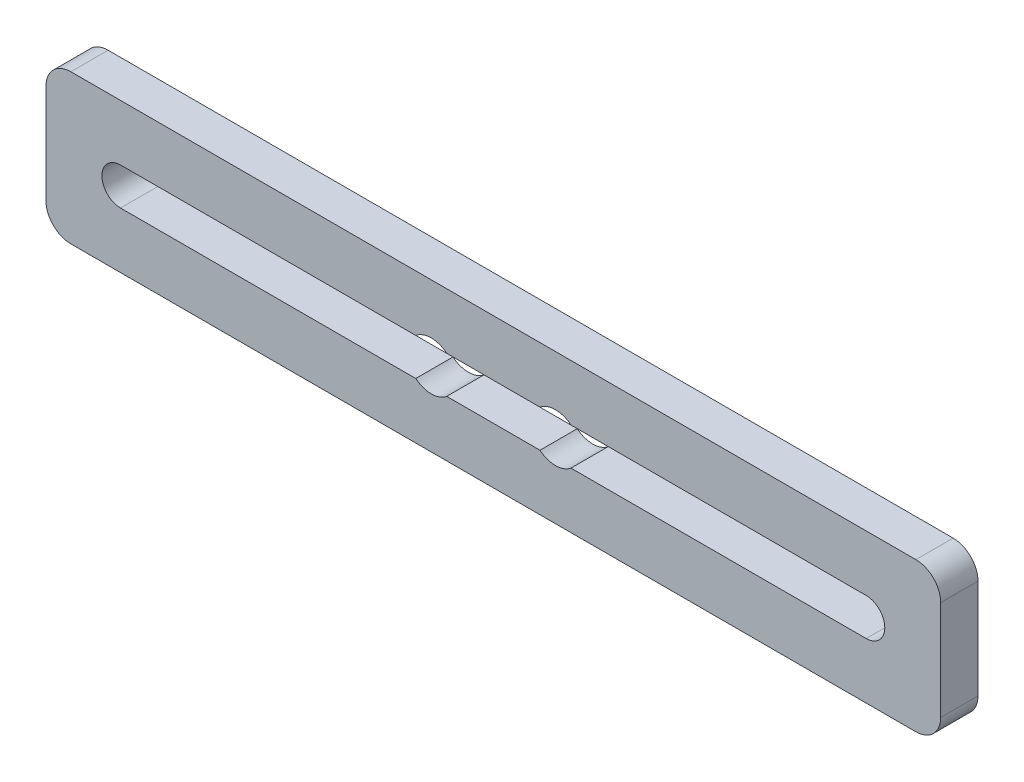
ISO-10303-21;
HEADER;
FILE_DESCRIPTION(('STEP AP214'),'2;1');
FILE_NAME('part.step','',(''),(''),'','','');
FILE_SCHEMA(('AUTOMOTIVE_DESIGN { 1 0 10303 214 1 1 1 1 }'));
ENDSEC;
DATA;
#1=APPLICATION_CONTEXT('core data for automotive mechanical design processes');
#2=APPLICATION_PROTOCOL_DEFINITION('international standard','automotive_design',2000,#1);
#3=PRODUCT_CONTEXT('',#1,'mechanical');
#4=PRODUCT('Part','Part','',(#3));
#5=PRODUCT_RELATED_PRODUCT_CATEGORY('part','',(#4));
#6=PRODUCT_DEFINITION_FORMATION('','',#4);
#7=PRODUCT_DEFINITION_CONTEXT('part definition',#1,'design');
#8=PRODUCT_DEFINITION('design','',#6,#7);
#9=PRODUCT_DEFINITION_SHAPE('','',#8);
#10=(LENGTH_UNIT() NAMED_UNIT(*) SI_UNIT(.MILLI.,.METRE.));
#11=(NAMED_UNIT(*) PLANE_ANGLE_UNIT() SI_UNIT($,.RADIAN.));
#12=(NAMED_UNIT(*) SI_UNIT($,.STERADIAN.) SOLID_ANGLE_UNIT());
#13=UNCERTAINTY_MEASURE_WITH_UNIT(LENGTH_MEASURE(1.E-05),#10,'distance_accuracy_value','');
#14=(GEOMETRIC_REPRESENTATION_CONTEXT(3) GLOBAL_UNCERTAINTY_ASSIGNED_CONTEXT((#13)) GLOBAL_UNIT_ASSIGNED_CONTEXT((#10,
#11,#12)) REPRESENTATION_CONTEXT('',''));
#15=CARTESIAN_POINT('',(0.,0.,0.));
#16=DIRECTION('',(0.,0.,1.));
#17=DIRECTION('',(1.,0.,0.));
#18=AXIS2_PLACEMENT_3D('',#15,#16,#17);
#19=CARTESIAN_POINT('',(6.,-4.5,0.));
#20=DIRECTION('',(0.,1.,0.));
#21=DIRECTION('',(0.,0.,1.));
#22=AXIS2_PLACEMENT_3D('',#19,#20,#21);
#23=PLANE('',#22);
#24=DIRECTION('',(-1.,0.,0.));
#25=VECTOR('',#24,1.);
#26=CARTESIAN_POINT('',(6.,-4.5,0.));
#27=LINE('',#26,#25);
#28=CARTESIAN_POINT('',(39.7540064205623,-4.5,0.));
#29=VERTEX_POINT('',#28);
#30=CARTESIAN_POINT('',(32.2459935794377,-4.5,0.));
#31=VERTEX_POINT('',#30);
#32=EDGE_CURVE('E233',#29,#31,#27,.T.);
#33=ORIENTED_EDGE('',*,*,#32,.F.);
#34=DIRECTION('',(0.,0.,1.));
#35=VECTOR('',#34,1.);
#36=CARTESIAN_POINT('',(39.7540064205623,-4.5,0.));
#37=LINE('',#36,#35);
#38=CARTESIAN_POINT('',(39.7540064205623,-4.5,3.));
#39=VERTEX_POINT('',#38);
#40=EDGE_CURVE('E223',#29,#39,#37,.T.);
#41=ORIENTED_EDGE('',*,*,#40,.T.);
#42=DIRECTION('',(-1.,0.,0.));
#43=VECTOR('',#42,1.);
#44=CARTESIAN_POINT('',(6.,-4.5,3.));
#45=LINE('',#44,#43);
#46=CARTESIAN_POINT('',(32.2459935794377,-4.5,3.));
#47=VERTEX_POINT('',#46);
#48=EDGE_CURVE('E398',#39,#47,#45,.T.);
#49=ORIENTED_EDGE('',*,*,#48,.T.);
#50=DIRECTION('',(0.,0.,1.));
#51=VECTOR('',#50,1.);
#52=CARTESIAN_POINT('',(32.2459935794377,-4.5,0.));
#53=LINE('',#52,#51);
#54=EDGE_CURVE('E251',#47,#31,#53,.F.);
#55=ORIENTED_EDGE('',*,*,#54,.T.);
#56=EDGE_LOOP('',(#33,#41,#49,#55));
#57=FACE_BOUND('',#56,.T.);
#58=ADVANCED_FACE('F43',(#57),#23,.F.);
#59=CARTESIAN_POINT('',(29.7540064205623,-4.5,0.));
#60=VERTEX_POINT('',#59);
#61=CARTESIAN_POINT('',(6.,-4.5,0.));
#62=VERTEX_POINT('',#61);
#63=EDGE_CURVE('E234',#60,#62,#27,.T.);
#64=ORIENTED_EDGE('',*,*,#63,.F.);
#65=DIRECTION('',(0.,0.,1.));
#66=VECTOR('',#65,1.);
#67=CARTESIAN_POINT('',(29.7540064205623,-4.5,0.));
#68=LINE('',#67,#66);
#69=CARTESIAN_POINT('',(29.7540064205623,-4.5,3.));
#70=VERTEX_POINT('',#69);
#71=EDGE_CURVE('E248',#60,#70,#68,.T.);
#72=ORIENTED_EDGE('',*,*,#71,.T.);
#73=CARTESIAN_POINT('',(6.,-4.5,3.));
#74=VERTEX_POINT('',#73);
#75=EDGE_CURVE('E214',#70,#74,#45,.T.);
#76=ORIENTED_EDGE('',*,*,#75,.T.);
#77=DIRECTION('',(0.,0.,1.));
#78=VECTOR('',#77,1.);
#79=CARTESIAN_POINT('',(6.,-4.5,0.));
#80=LINE('',#79,#78);
#81=EDGE_CURVE('E280',#62,#74,#80,.T.);
#82=ORIENTED_EDGE('',*,*,#81,.F.);
#83=EDGE_LOOP('',(#64,#72,#76,#82));
#84=FACE_BOUND('',#83,.T.);
#85=ADVANCED_FACE('F374',(#84),#23,.F.);
#86=CARTESIAN_POINT('',(6.,-7.5,0.));
#87=DIRECTION('',(0.,-1.,0.));
#88=DIRECTION('',(0.,0.,-1.));
#89=AXIS2_PLACEMENT_3D('',#86,#87,#88);
#90=PLANE('',#89);
#91=DIRECTION('',(1.,0.,0.));
#92=VECTOR('',#91,1.);
#93=CARTESIAN_POINT('',(6.,-7.5,0.));
#94=LINE('',#93,#92);
#95=CARTESIAN_POINT('',(42.2459935794377,-7.5,0.));
#96=VERTEX_POINT('',#95);
#97=CARTESIAN_POINT('',(66.,-7.5,0.));
#98=VERTEX_POINT('',#97);
#99=EDGE_CURVE('E241',#96,#98,#94,.T.);
#100=ORIENTED_EDGE('',*,*,#99,.F.);
#101=DIRECTION('',(0.,0.,1.));
#102=VECTOR('',#101,1.);
#103=CARTESIAN_POINT('',(42.2459935794377,-7.5,0.));
#104=LINE('',#103,#102);
#105=CARTESIAN_POINT('',(42.2459935794377,-7.5,3.));
#106=VERTEX_POINT('',#105);
#107=EDGE_CURVE('E274',#96,#106,#104,.T.);
#108=ORIENTED_EDGE('',*,*,#107,.T.);
#109=DIRECTION('',(1.,0.,0.));
#110=VECTOR('',#109,1.);
#111=CARTESIAN_POINT('',(6.,-7.5,3.));
#112=LINE('',#111,#110);
#113=CARTESIAN_POINT('',(66.,-7.5,3.));
#114=VERTEX_POINT('',#113);
#115=EDGE_CURVE('E212',#106,#114,#112,.T.);
#116=ORIENTED_EDGE('',*,*,#115,.T.);
#117=DIRECTION('',(0.,0.,1.));
#118=VECTOR('',#117,1.);
#119=CARTESIAN_POINT('',(66.,-7.5,0.));
#120=LINE('',#119,#118);
#121=EDGE_CURVE('E275',#98,#114,#120,.T.);
#122=ORIENTED_EDGE('',*,*,#121,.F.);
#123=EDGE_LOOP('',(#100,#108,#116,#122));
#124=FACE_BOUND('',#123,.T.);
#125=ADVANCED_FACE('F273',(#124),#90,.F.);
#126=CARTESIAN_POINT('',(32.2459935794377,-7.5,3.));
#127=VERTEX_POINT('',#126);
#128=CARTESIAN_POINT('',(39.7540064205623,-7.5,3.));
#129=VERTEX_POINT('',#128);
#130=EDGE_CURVE('E203',#127,#129,#112,.T.);
#131=ORIENTED_EDGE('',*,*,#130,.T.);
#132=DIRECTION('',(0.,0.,1.));
#133=VECTOR('',#132,1.);
#134=CARTESIAN_POINT('',(39.7540064205623,-7.5,0.));
#135=LINE('',#134,#133);
#136=CARTESIAN_POINT('',(39.7540064205623,-7.5,0.));
#137=VERTEX_POINT('',#136);
#138=EDGE_CURVE('E306',#129,#137,#135,.F.);
#139=ORIENTED_EDGE('',*,*,#138,.T.);
#140=CARTESIAN_POINT('',(32.2459935794377,-7.5,0.));
#141=VERTEX_POINT('',#140);
#142=EDGE_CURVE('E240',#141,#137,#94,.T.);
#143=ORIENTED_EDGE('',*,*,#142,.F.);
#144=DIRECTION('',(0.,0.,1.));
#145=VECTOR('',#144,1.);
#146=CARTESIAN_POINT('',(32.2459935794377,-7.5,0.));
#147=LINE('',#146,#145);
#148=EDGE_CURVE('E191',#141,#127,#147,.T.);
#149=ORIENTED_EDGE('',*,*,#148,.T.);
#150=EDGE_LOOP('',(#131,#139,#143,#149));
#151=FACE_BOUND('',#150,.T.);
#152=ADVANCED_FACE('F428',(#151),#90,.F.);
#153=CARTESIAN_POINT('',(0.,0.,3.));
#154=DIRECTION('',(1.,0.,0.));
#155=DIRECTION('',(0.,1.,0.));
#156=AXIS2_PLACEMENT_3D('',#153,#154,#155);
#157=PLANE('',#156);
#158=DIRECTION('',(0.,-1.,0.));
#159=VECTOR('',#158,1.);
#160=CARTESIAN_POINT('',(0.,0.,0.));
#161=LINE('',#160,#159);
#162=CARTESIAN_POINT('',(0.,-2.,0.));
#163=VERTEX_POINT('',#162);
#164=CARTESIAN_POINT('',(0.,-10.,0.));
#165=VERTEX_POINT('',#164);
#166=EDGE_CURVE('E295',#163,#165,#161,.T.);
#167=ORIENTED_EDGE('',*,*,#166,.T.);
#168=DIRECTION('',(0.,0.,-1.));
#169=VECTOR('',#168,1.);
#170=CARTESIAN_POINT('',(0.,-10.,3.));
#171=LINE('',#170,#169);
#172=CARTESIAN_POINT('',(0.,-10.,3.));
#173=VERTEX_POINT('',#172);
#174=EDGE_CURVE('E11',#165,#173,#171,.F.);
#175=ORIENTED_EDGE('',*,*,#174,.T.);
#176=DIRECTION('',(0.,-1.,0.));
#177=VECTOR('',#176,1.);
#178=CARTESIAN_POINT('',(0.,0.,3.));
#179=LINE('',#178,#177);
#180=CARTESIAN_POINT('',(0.,-2.,3.));
#181=VERTEX_POINT('',#180);
#182=EDGE_CURVE('E285',#181,#173,#179,.T.);
#183=ORIENTED_EDGE('',*,*,#182,.F.);
#184=DIRECTION('',(0.,0.,-1.));
#185=VECTOR('',#184,1.);
#186=CARTESIAN_POINT('',(0.,-2.,3.));
#187=LINE('',#186,#185);
#188=EDGE_CURVE('E51',#181,#163,#187,.T.);
#189=ORIENTED_EDGE('',*,*,#188,.T.);
#190=EDGE_LOOP('',(#167,#175,#183,#189));
#191=FACE_BOUND('',#190,.T.);
#192=ADVANCED_FACE('F342',(#191),#157,.F.);
#193=CARTESIAN_POINT('',(0.,-12.,3.));
#194=DIRECTION('',(0.,1.,0.));
#195=DIRECTION('',(0.,0.,1.));
#196=AXIS2_PLACEMENT_3D('',#193,#194,#195);
#197=PLANE('',#196);
#198=DIRECTION('',(1.,0.,0.));
#199=VECTOR('',#198,1.);
#200=CARTESIAN_POINT('',(0.,-12.,0.));
#201=LINE('',#200,#199);
#202=CARTESIAN_POINT('',(2.00000000000001,-12.,0.));
#203=VERTEX_POINT('',#202);
#204=CARTESIAN_POINT('',(70.,-12.,0.));
#205=VERTEX_POINT('',#204);
#206=EDGE_CURVE('E298',#203,#205,#201,.T.);
#207=ORIENTED_EDGE('',*,*,#206,.T.);
#208=DIRECTION('',(0.,0.,-1.));
#209=VECTOR('',#208,1.);
#210=CARTESIAN_POINT('',(70.,-12.,3.));
#211=LINE('',#210,#209);
#212=CARTESIAN_POINT('',(70.,-12.,3.));
#213=VERTEX_POINT('',#212);
#214=EDGE_CURVE('E58',#205,#213,#211,.F.);
#215=ORIENTED_EDGE('',*,*,#214,.T.);
#216=DIRECTION('',(1.,0.,0.));
#217=VECTOR('',#216,1.);
#218=CARTESIAN_POINT('',(0.,-12.,3.));
#219=LINE('',#218,#217);
#220=CARTESIAN_POINT('',(2.00000000000001,-12.,3.));
#221=VERTEX_POINT('',#220);
#222=EDGE_CURVE('E287',#221,#213,#219,.T.);
#223=ORIENTED_EDGE('',*,*,#222,.F.);
#224=DIRECTION('',(0.,0.,-1.));
#225=VECTOR('',#224,1.);
#226=CARTESIAN_POINT('',(2.00000000000001,-12.,3.));
#227=LINE('',#226,#225);
#228=EDGE_CURVE('E334',#221,#203,#227,.T.);
#229=ORIENTED_EDGE('',*,*,#228,.T.);
#230=EDGE_LOOP('',(#207,#215,#223,#229));
#231=FACE_BOUND('',#230,.T.);
#232=ADVANCED_FACE('F351',(#231),#197,.F.);
#233=CARTESIAN_POINT('',(72.,0.,3.));
#234=DIRECTION('',(-1.,0.,0.));
#235=DIRECTION('',(0.,0.,1.));
#236=AXIS2_PLACEMENT_3D('',#233,#234,#235);
#237=PLANE('',#236);
#238=DIRECTION('',(0.,1.,0.));
#239=VECTOR('',#238,1.);
#240=CARTESIAN_POINT('',(72.,0.,0.));
#241=LINE('',#240,#239);
#242=CARTESIAN_POINT('',(72.,-10.,0.));
#243=VERTEX_POINT('',#242);
#244=CARTESIAN_POINT('',(72.,-2.,0.));
#245=VERTEX_POINT('',#244);
#246=EDGE_CURVE('E300',#243,#245,#241,.T.);
#247=ORIENTED_EDGE('',*,*,#246,.T.);
#248=DIRECTION('',(0.,0.,-1.));
#249=VECTOR('',#248,1.);
#250=CARTESIAN_POINT('',(72.,-2.,3.));
#251=LINE('',#250,#249);
#252=CARTESIAN_POINT('',(72.,-2.,3.));
#253=VERTEX_POINT('',#252);
#254=EDGE_CURVE('E325',#245,#253,#251,.F.);
#255=ORIENTED_EDGE('',*,*,#254,.T.);
#256=DIRECTION('',(0.,1.,0.));
#257=VECTOR('',#256,1.);
#258=CARTESIAN_POINT('',(72.,0.,3.));
#259=LINE('',#258,#257);
#260=CARTESIAN_POINT('',(72.,-10.,3.));
#261=VERTEX_POINT('',#260);
#262=EDGE_CURVE('E290',#261,#253,#259,.T.);
#263=ORIENTED_EDGE('',*,*,#262,.F.);
#264=DIRECTION('',(0.,0.,-1.));
#265=VECTOR('',#264,1.);
#266=CARTESIAN_POINT('',(72.,-10.,3.));
#267=LINE('',#266,#265);
#268=EDGE_CURVE('E322',#261,#243,#267,.T.);
#269=ORIENTED_EDGE('',*,*,#268,.T.);
#270=EDGE_LOOP('',(#247,#255,#263,#269));
#271=FACE_BOUND('',#270,.T.);
#272=ADVANCED_FACE('F359',(#271),#237,.F.);
#273=CARTESIAN_POINT('',(0.,0.,3.));
#274=DIRECTION('',(0.,-1.,0.));
#275=DIRECTION('',(0.,0.,-1.));
#276=AXIS2_PLACEMENT_3D('',#273,#274,#275);
#277=PLANE('',#276);
#278=DIRECTION('',(-1.,0.,0.));
#279=VECTOR('',#278,1.);
#280=CARTESIAN_POINT('',(0.,0.,3.));
#281=LINE('',#280,#279);
#282=CARTESIAN_POINT('',(70.,0.,3.));
#283=VERTEX_POINT('',#282);
#284=CARTESIAN_POINT('',(2.,0.,3.));
#285=VERTEX_POINT('',#284);
#286=EDGE_CURVE('E192',#283,#285,#281,.T.);
#287=ORIENTED_EDGE('',*,*,#286,.F.);
#288=DIRECTION('',(0.,0.,-1.));
#289=VECTOR('',#288,1.);
#290=CARTESIAN_POINT('',(70.,0.,3.));
#291=LINE('',#290,#289);
#292=CARTESIAN_POINT('',(70.,0.,0.));
#293=VERTEX_POINT('',#292);
#294=EDGE_CURVE('E311',#283,#293,#291,.T.);
#295=ORIENTED_EDGE('',*,*,#294,.T.);
#296=DIRECTION('',(-1.,0.,0.));
#297=VECTOR('',#296,1.);
#298=CARTESIAN_POINT('',(0.,0.,0.));
#299=LINE('',#298,#297);
#300=CARTESIAN_POINT('',(2.,0.,0.));
#301=VERTEX_POINT('',#300);
#302=EDGE_CURVE('E288',#293,#301,#299,.T.);
#303=ORIENTED_EDGE('',*,*,#302,.T.);
#304=DIRECTION('',(0.,0.,-1.));
#305=VECTOR('',#304,1.);
#306=CARTESIAN_POINT('',(2.,0.,3.));
#307=LINE('',#306,#305);
#308=EDGE_CURVE('E309',#301,#285,#307,.F.);
#309=ORIENTED_EDGE('',*,*,#308,.T.);
#310=EDGE_LOOP('',(#287,#295,#303,#309));
#311=FACE_BOUND('',#310,.T.);
#312=ADVANCED_FACE('F367',(#311),#277,.F.);
#313=CARTESIAN_POINT('',(0.,0.,3.));
#314=DIRECTION('',(0.,0.,1.));
#315=DIRECTION('',(1.,0.,0.));
#316=AXIS2_PLACEMENT_3D('',#313,#314,#315);
#317=PLANE('',#316);
#318=CARTESIAN_POINT('',(41.,-6.,3.));
#319=DIRECTION('',(0.,0.,1.));
#320=DIRECTION('',(1.,0.,0.));
#321=AXIS2_PLACEMENT_3D('',#318,#319,#320);
#322=CIRCLE('',#321,1.95);
#323=CARTESIAN_POINT('',(42.2459935794377,-4.5,3.));
#324=VERTEX_POINT('',#323);
#325=EDGE_CURVE('E257',#324,#39,#322,.T.);
#326=ORIENTED_EDGE('',*,*,#325,.F.);
#327=CARTESIAN_POINT('',(66.,-4.5,3.));
#328=VERTEX_POINT('',#327);
#329=EDGE_CURVE('E244',#328,#324,#45,.T.);
#330=ORIENTED_EDGE('',*,*,#329,.F.);
#331=CARTESIAN_POINT('',(66.,-6.,3.));
#332=DIRECTION('',(0.,0.,1.));
#333=DIRECTION('',(1.,0.,0.));
#334=AXIS2_PLACEMENT_3D('',#331,#332,#333);
#335=CIRCLE('',#334,1.5);
#336=EDGE_CURVE('E210',#114,#328,#335,.T.);
#337=ORIENTED_EDGE('',*,*,#336,.F.);
#338=ORIENTED_EDGE('',*,*,#115,.F.);
#339=EDGE_CURVE('E204',#129,#106,#322,.T.);
#340=ORIENTED_EDGE('',*,*,#339,.F.);
#341=ORIENTED_EDGE('',*,*,#130,.F.);
#342=CARTESIAN_POINT('',(31.,-6.,3.));
#343=DIRECTION('',(0.,0.,1.));
#344=DIRECTION('',(-1.,0.,0.));
#345=AXIS2_PLACEMENT_3D('',#342,#343,#344);
#346=CIRCLE('',#345,1.95);
#347=CARTESIAN_POINT('',(29.7540064205623,-7.5,3.));
#348=VERTEX_POINT('',#347);
#349=EDGE_CURVE('E183',#348,#127,#346,.T.);
#350=ORIENTED_EDGE('',*,*,#349,.F.);
#351=CARTESIAN_POINT('',(6.,-7.5,3.));
#352=VERTEX_POINT('',#351);
#353=EDGE_CURVE('E200',#352,#348,#112,.T.);
#354=ORIENTED_EDGE('',*,*,#353,.F.);
#355=CARTESIAN_POINT('',(6.,-6.,3.));
#356=DIRECTION('',(0.,0.,1.));
#357=DIRECTION('',(1.,0.,0.));
#358=AXIS2_PLACEMENT_3D('',#355,#356,#357);
#359=CIRCLE('',#358,1.5);
#360=EDGE_CURVE('E217',#74,#352,#359,.T.);
#361=ORIENTED_EDGE('',*,*,#360,.F.);
#362=ORIENTED_EDGE('',*,*,#75,.F.);
#363=EDGE_CURVE('E205',#47,#70,#346,.T.);
#364=ORIENTED_EDGE('',*,*,#363,.F.);
#365=ORIENTED_EDGE('',*,*,#48,.F.);
#366=EDGE_LOOP('',(#326,#330,#337,#338,#340,#341,#350,#354,#361,#362,#364,#365));
#367=FACE_BOUND('',#366,.T.);
#368=ORIENTED_EDGE('',*,*,#262,.T.);
#369=CARTESIAN_POINT('',(70.,-2.,3.));
#370=DIRECTION('',(0.,0.,1.));
#371=DIRECTION('',(1.,0.,0.));
#372=AXIS2_PLACEMENT_3D('',#369,#370,#371);
#373=CIRCLE('',#372,2.);
#374=EDGE_CURVE('E332',#253,#283,#373,.T.);
#375=ORIENTED_EDGE('',*,*,#374,.T.);
#376=ORIENTED_EDGE('',*,*,#286,.T.);
#377=CARTESIAN_POINT('',(2.,-2.,3.));
#378=DIRECTION('',(0.,0.,1.));
#379=DIRECTION('',(1.,0.,0.));
#380=AXIS2_PLACEMENT_3D('',#377,#378,#379);
#381=CIRCLE('',#380,2.);
#382=EDGE_CURVE('E327',#285,#181,#381,.T.);
#383=ORIENTED_EDGE('',*,*,#382,.T.);
#384=ORIENTED_EDGE('',*,*,#182,.T.);
#385=CARTESIAN_POINT('',(2.00000000000001,-10.,3.));
#386=DIRECTION('',(0.,0.,1.));
#387=DIRECTION('',(1.,0.,0.));
#388=AXIS2_PLACEMENT_3D('',#385,#386,#387);
#389=CIRCLE('',#388,2.);
#390=EDGE_CURVE('E65',#173,#221,#389,.T.);
#391=ORIENTED_EDGE('',*,*,#390,.T.);
#392=ORIENTED_EDGE('',*,*,#222,.T.);
#393=CARTESIAN_POINT('',(70.,-10.,3.));
#394=DIRECTION('',(0.,0.,1.));
#395=DIRECTION('',(1.,0.,0.));
#396=AXIS2_PLACEMENT_3D('',#393,#394,#395);
#397=CIRCLE('',#396,2.);
#398=EDGE_CURVE('E330',#213,#261,#397,.T.);
#399=ORIENTED_EDGE('',*,*,#398,.T.);
#400=EDGE_LOOP('',(#368,#375,#376,#383,#384,#391,#392,#399));
#401=FACE_BOUND('',#400,.T.);
#402=ADVANCED_FACE('F198',(#367,#401),#317,.T.);
#403=CARTESIAN_POINT('',(0.,0.,0.));
#404=DIRECTION('',(0.,0.,1.));
#405=DIRECTION('',(1.,0.,0.));
#406=AXIS2_PLACEMENT_3D('',#403,#404,#405);
#407=PLANE('',#406);
#408=CARTESIAN_POINT('',(66.,-4.5,0.));
#409=VERTEX_POINT('',#408);
#410=CARTESIAN_POINT('',(42.2459935794377,-4.5,0.));
#411=VERTEX_POINT('',#410);
#412=EDGE_CURVE('E230',#409,#411,#27,.T.);
#413=ORIENTED_EDGE('',*,*,#412,.T.);
#414=CARTESIAN_POINT('',(41.,-6.,0.));
#415=DIRECTION('',(0.,0.,1.));
#416=DIRECTION('',(1.,0.,0.));
#417=AXIS2_PLACEMENT_3D('',#414,#415,#416);
#418=CIRCLE('',#417,1.95);
#419=EDGE_CURVE('E254',#411,#29,#418,.T.);
#420=ORIENTED_EDGE('',*,*,#419,.T.);
#421=ORIENTED_EDGE('',*,*,#32,.T.);
#422=CARTESIAN_POINT('',(31.,-6.,0.));
#423=DIRECTION('',(0.,0.,1.));
#424=DIRECTION('',(-1.,0.,0.));
#425=AXIS2_PLACEMENT_3D('',#422,#423,#424);
#426=CIRCLE('',#425,1.95);
#427=EDGE_CURVE('E255',#31,#60,#426,.T.);
#428=ORIENTED_EDGE('',*,*,#427,.T.);
#429=ORIENTED_EDGE('',*,*,#63,.T.);
#430=CARTESIAN_POINT('',(6.,-6.,0.));
#431=DIRECTION('',(0.,0.,1.));
#432=DIRECTION('',(1.,0.,0.));
#433=AXIS2_PLACEMENT_3D('',#430,#431,#432);
#434=CIRCLE('',#433,1.5);
#435=CARTESIAN_POINT('',(6.,-7.5,0.));
#436=VERTEX_POINT('',#435);
#437=EDGE_CURVE('E242',#62,#436,#434,.T.);
#438=ORIENTED_EDGE('',*,*,#437,.T.);
#439=CARTESIAN_POINT('',(29.7540064205623,-7.5,0.));
#440=VERTEX_POINT('',#439);
#441=EDGE_CURVE('E238',#436,#440,#94,.T.);
#442=ORIENTED_EDGE('',*,*,#441,.T.);
#443=EDGE_CURVE('E186',#440,#141,#426,.T.);
#444=ORIENTED_EDGE('',*,*,#443,.T.);
#445=ORIENTED_EDGE('',*,*,#142,.T.);
#446=EDGE_CURVE('E259',#137,#96,#418,.T.);
#447=ORIENTED_EDGE('',*,*,#446,.T.);
#448=ORIENTED_EDGE('',*,*,#99,.T.);
#449=CARTESIAN_POINT('',(66.,-6.,0.));
#450=DIRECTION('',(0.,0.,1.));
#451=DIRECTION('',(1.,0.,0.));
#452=AXIS2_PLACEMENT_3D('',#449,#450,#451);
#453=CIRCLE('',#452,1.5);
#454=EDGE_CURVE('E235',#98,#409,#453,.T.);
#455=ORIENTED_EDGE('',*,*,#454,.T.);
#456=EDGE_LOOP('',(#413,#420,#421,#428,#429,#438,#442,#444,#445,#447,#448,#455));
#457=FACE_BOUND('',#456,.T.);
#458=ORIENTED_EDGE('',*,*,#302,.F.);
#459=CARTESIAN_POINT('',(70.,-2.,0.));
#460=DIRECTION('',(0.,0.,1.));
#461=DIRECTION('',(1.,0.,0.));
#462=AXIS2_PLACEMENT_3D('',#459,#460,#461);
#463=CIRCLE('',#462,2.);
#464=EDGE_CURVE('E320',#293,#245,#463,.F.);
#465=ORIENTED_EDGE('',*,*,#464,.T.);
#466=ORIENTED_EDGE('',*,*,#246,.F.);
#467=CARTESIAN_POINT('',(70.,-10.,0.));
#468=DIRECTION('',(0.,0.,1.));
#469=DIRECTION('',(1.,0.,0.));
#470=AXIS2_PLACEMENT_3D('',#467,#468,#469);
#471=CIRCLE('',#470,2.);
#472=EDGE_CURVE('E318',#243,#205,#471,.F.);
#473=ORIENTED_EDGE('',*,*,#472,.T.);
#474=ORIENTED_EDGE('',*,*,#206,.F.);
#475=CARTESIAN_POINT('',(2.00000000000001,-10.,0.));
#476=DIRECTION('',(0.,0.,1.));
#477=DIRECTION('',(1.,0.,0.));
#478=AXIS2_PLACEMENT_3D('',#475,#476,#477);
#479=CIRCLE('',#478,2.);
#480=EDGE_CURVE('E316',#203,#165,#479,.F.);
#481=ORIENTED_EDGE('',*,*,#480,.T.);
#482=ORIENTED_EDGE('',*,*,#166,.F.);
#483=CARTESIAN_POINT('',(2.,-2.,0.));
#484=DIRECTION('',(0.,0.,1.));
#485=DIRECTION('',(1.,0.,0.));
#486=AXIS2_PLACEMENT_3D('',#483,#484,#485);
#487=CIRCLE('',#486,2.);
#488=EDGE_CURVE('E314',#163,#301,#487,.F.);
#489=ORIENTED_EDGE('',*,*,#488,.T.);
#490=EDGE_LOOP('',(#458,#465,#466,#473,#474,#481,#482,#489));
#491=FACE_BOUND('',#490,.T.);
#492=ADVANCED_FACE('F267',(#457,#491),#407,.F.);
#493=CARTESIAN_POINT('',(6.,-6.,0.));
#494=DIRECTION('',(0.,0.,1.));
#495=DIRECTION('',(1.,0.,0.));
#496=AXIS2_PLACEMENT_3D('',#493,#494,#495);
#497=CYLINDRICAL_SURFACE('',#496,1.5);
#498=ORIENTED_EDGE('',*,*,#360,.T.);
#499=DIRECTION('',(0.,0.,1.));
#500=VECTOR('',#499,1.);
#501=CARTESIAN_POINT('',(6.,-7.5,0.));
#502=LINE('',#501,#500);
#503=EDGE_CURVE('E209',#436,#352,#502,.T.);
#504=ORIENTED_EDGE('',*,*,#503,.F.);
#505=ORIENTED_EDGE('',*,*,#437,.F.);
#506=ORIENTED_EDGE('',*,*,#81,.T.);
#507=EDGE_LOOP('',(#498,#504,#505,#506));
#508=FACE_BOUND('',#507,.T.);
#509=ADVANCED_FACE('F387',(#508),#497,.F.);
#510=ORIENTED_EDGE('',*,*,#329,.T.);
#511=DIRECTION('',(0.,0.,1.));
#512=VECTOR('',#511,1.);
#513=CARTESIAN_POINT('',(42.2459935794377,-4.5,0.));
#514=LINE('',#513,#512);
#515=EDGE_CURVE('E227',#324,#411,#514,.F.);
#516=ORIENTED_EDGE('',*,*,#515,.T.);
#517=ORIENTED_EDGE('',*,*,#412,.F.);
#518=DIRECTION('',(0.,0.,1.));
#519=VECTOR('',#518,1.);
#520=CARTESIAN_POINT('',(66.,-4.5,0.));
#521=LINE('',#520,#519);
#522=EDGE_CURVE('E278',#409,#328,#521,.T.);
#523=ORIENTED_EDGE('',*,*,#522,.T.);
#524=EDGE_LOOP('',(#510,#516,#517,#523));
#525=FACE_BOUND('',#524,.T.);
#526=ADVANCED_FACE('F377',(#525),#23,.F.);
#527=CARTESIAN_POINT('',(66.,-6.,0.));
#528=DIRECTION('',(0.,0.,1.));
#529=DIRECTION('',(1.,0.,0.));
#530=AXIS2_PLACEMENT_3D('',#527,#528,#529);
#531=CYLINDRICAL_SURFACE('',#530,1.5);
#532=ORIENTED_EDGE('',*,*,#336,.T.);
#533=ORIENTED_EDGE('',*,*,#522,.F.);
#534=ORIENTED_EDGE('',*,*,#454,.F.);
#535=ORIENTED_EDGE('',*,*,#121,.T.);
#536=EDGE_LOOP('',(#532,#533,#534,#535));
#537=FACE_BOUND('',#536,.T.);
#538=ADVANCED_FACE('F386',(#537),#531,.F.);
#539=ORIENTED_EDGE('',*,*,#353,.T.);
#540=DIRECTION('',(0.,0.,1.));
#541=VECTOR('',#540,1.);
#542=CARTESIAN_POINT('',(29.7540064205623,-7.5,0.));
#543=LINE('',#542,#541);
#544=EDGE_CURVE('E180',#348,#440,#543,.F.);
#545=ORIENTED_EDGE('',*,*,#544,.T.);
#546=ORIENTED_EDGE('',*,*,#441,.F.);
#547=ORIENTED_EDGE('',*,*,#503,.T.);
#548=EDGE_LOOP('',(#539,#545,#546,#547));
#549=FACE_BOUND('',#548,.T.);
#550=ADVANCED_FACE('F208',(#549),#90,.F.);
#551=CARTESIAN_POINT('',(31.,-6.,0.));
#552=DIRECTION('',(0.,0.,1.));
#553=DIRECTION('',(1.,0.,0.));
#554=AXIS2_PLACEMENT_3D('',#551,#552,#553);
#555=CYLINDRICAL_SURFACE('',#554,1.95);
#556=ORIENTED_EDGE('',*,*,#443,.F.);
#557=ORIENTED_EDGE('',*,*,#544,.F.);
#558=ORIENTED_EDGE('',*,*,#349,.T.);
#559=ORIENTED_EDGE('',*,*,#148,.F.);
#560=EDGE_LOOP('',(#556,#557,#558,#559));
#561=FACE_BOUND('',#560,.T.);
#562=ADVANCED_FACE('F182',(#561),#555,.F.);
#563=CARTESIAN_POINT('',(41.,-6.,0.));
#564=DIRECTION('',(0.,0.,1.));
#565=DIRECTION('',(1.,0.,0.));
#566=AXIS2_PLACEMENT_3D('',#563,#564,#565);
#567=CYLINDRICAL_SURFACE('',#566,1.95);
#568=ORIENTED_EDGE('',*,*,#446,.F.);
#569=ORIENTED_EDGE('',*,*,#138,.F.);
#570=ORIENTED_EDGE('',*,*,#339,.T.);
#571=ORIENTED_EDGE('',*,*,#107,.F.);
#572=EDGE_LOOP('',(#568,#569,#570,#571));
#573=FACE_BOUND('',#572,.T.);
#574=ADVANCED_FACE('F414',(#573),#567,.F.);
#575=ORIENTED_EDGE('',*,*,#427,.F.);
#576=ORIENTED_EDGE('',*,*,#54,.F.);
#577=ORIENTED_EDGE('',*,*,#363,.T.);
#578=ORIENTED_EDGE('',*,*,#71,.F.);
#579=EDGE_LOOP('',(#575,#576,#577,#578));
#580=FACE_BOUND('',#579,.T.);
#581=ADVANCED_FACE('F409',(#580),#555,.F.);
#582=ORIENTED_EDGE('',*,*,#419,.F.);
#583=ORIENTED_EDGE('',*,*,#515,.F.);
#584=ORIENTED_EDGE('',*,*,#325,.T.);
#585=ORIENTED_EDGE('',*,*,#40,.F.);
#586=EDGE_LOOP('',(#582,#583,#584,#585));
#587=FACE_BOUND('',#586,.T.);
#588=ADVANCED_FACE('F411',(#587),#567,.F.);
#589=CARTESIAN_POINT('',(70.,-2.,3.));
#590=DIRECTION('',(0.,0.,-1.));
#591=DIRECTION('',(-1.,0.,0.));
#592=AXIS2_PLACEMENT_3D('',#589,#590,#591);
#593=CYLINDRICAL_SURFACE('',#592,2.);
#594=ORIENTED_EDGE('',*,*,#374,.F.);
#595=ORIENTED_EDGE('',*,*,#254,.F.);
#596=ORIENTED_EDGE('',*,*,#464,.F.);
#597=ORIENTED_EDGE('',*,*,#294,.F.);
#598=EDGE_LOOP('',(#594,#595,#596,#597));
#599=FACE_BOUND('',#598,.T.);
#600=ADVANCED_FACE('F364',(#599),#593,.T.);
#601=CARTESIAN_POINT('',(70.,-10.,3.));
#602=DIRECTION('',(0.,0.,-1.));
#603=DIRECTION('',(-1.,0.,0.));
#604=AXIS2_PLACEMENT_3D('',#601,#602,#603);
#605=CYLINDRICAL_SURFACE('',#604,2.);
#606=ORIENTED_EDGE('',*,*,#398,.F.);
#607=ORIENTED_EDGE('',*,*,#214,.F.);
#608=ORIENTED_EDGE('',*,*,#472,.F.);
#609=ORIENTED_EDGE('',*,*,#268,.F.);
#610=EDGE_LOOP('',(#606,#607,#608,#609));
#611=FACE_BOUND('',#610,.T.);
#612=ADVANCED_FACE('F356',(#611),#605,.T.);
#613=CARTESIAN_POINT('',(2.00000000000001,-10.,3.));
#614=DIRECTION('',(0.,0.,-1.));
#615=DIRECTION('',(-1.,0.,0.));
#616=AXIS2_PLACEMENT_3D('',#613,#614,#615);
#617=CYLINDRICAL_SURFACE('',#616,2.);
#618=ORIENTED_EDGE('',*,*,#390,.F.);
#619=ORIENTED_EDGE('',*,*,#174,.F.);
#620=ORIENTED_EDGE('',*,*,#480,.F.);
#621=ORIENTED_EDGE('',*,*,#228,.F.);
#622=EDGE_LOOP('',(#618,#619,#620,#621));
#623=FACE_BOUND('',#622,.T.);
#624=ADVANCED_FACE('F350',(#623),#617,.T.);
#625=CARTESIAN_POINT('',(2.,-2.,3.));
#626=DIRECTION('',(0.,0.,-1.));
#627=DIRECTION('',(-1.,0.,0.));
#628=AXIS2_PLACEMENT_3D('',#625,#626,#627);
#629=CYLINDRICAL_SURFACE('',#628,2.);
#630=ORIENTED_EDGE('',*,*,#382,.F.);
#631=ORIENTED_EDGE('',*,*,#308,.F.);
#632=ORIENTED_EDGE('',*,*,#488,.F.);
#633=ORIENTED_EDGE('',*,*,#188,.F.);
#634=EDGE_LOOP('',(#630,#631,#632,#633));
#635=FACE_BOUND('',#634,.T.);
#636=ADVANCED_FACE('F45',(#635),#629,.T.);
#637=CLOSED_SHELL('',(#58,#85,#125,#152,#192,#232,#272,#312,#402,#492,#509,#526,#538,#550,#562,
#574,#581,#588,#600,#612,#624,#636));
#638=MANIFOLD_SOLID_BREP('B2',#637);
#639=ADVANCED_BREP_SHAPE_REPRESENTATION('',(#18,#638),#14);
#640=SHAPE_DEFINITION_REPRESENTATION(#9,#639);
ENDSEC;
END-ISO-10303-21;
